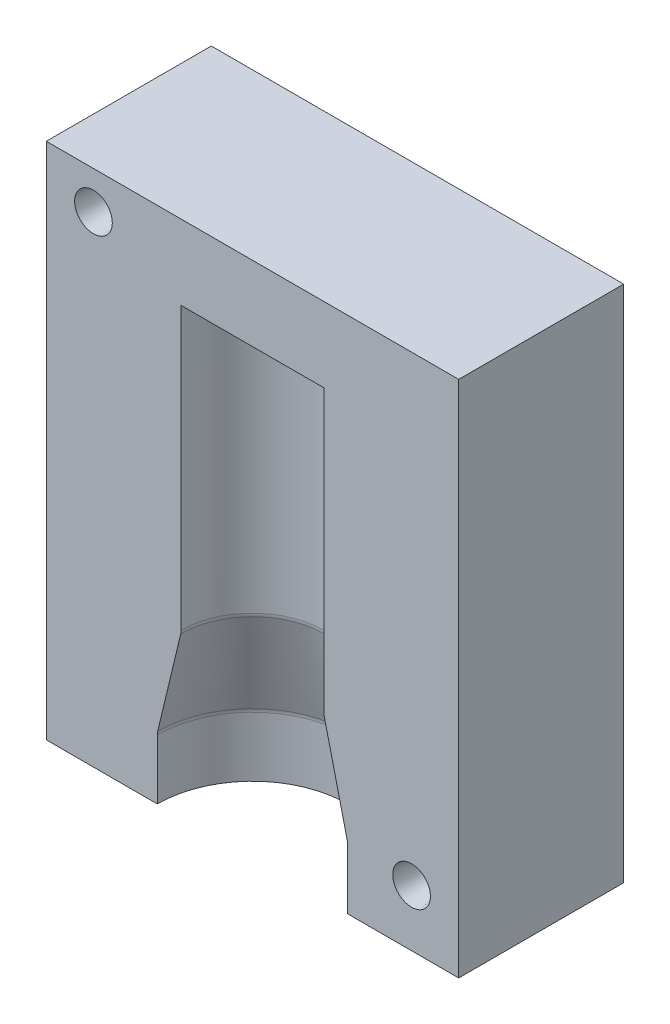
ISO-10303-21;
HEADER;
FILE_DESCRIPTION(('STEP AP214'),'2;1');
FILE_NAME('part.step','',(''),(''),'','','');
FILE_SCHEMA(('AUTOMOTIVE_DESIGN { 1 0 10303 214 1 1 1 1 }'));
ENDSEC;
DATA;
#1=APPLICATION_CONTEXT('core data for automotive mechanical design processes');
#2=APPLICATION_PROTOCOL_DEFINITION('international standard','automotive_design',2000,#1);
#3=PRODUCT_CONTEXT('',#1,'mechanical');
#4=PRODUCT('Part','Part','',(#3));
#5=PRODUCT_RELATED_PRODUCT_CATEGORY('part','',(#4));
#6=PRODUCT_DEFINITION_FORMATION('','',#4);
#7=PRODUCT_DEFINITION_CONTEXT('part definition',#1,'design');
#8=PRODUCT_DEFINITION('design','',#6,#7);
#9=PRODUCT_DEFINITION_SHAPE('','',#8);
#10=(LENGTH_UNIT() NAMED_UNIT(*) SI_UNIT(.MILLI.,.METRE.));
#11=(NAMED_UNIT(*) PLANE_ANGLE_UNIT() SI_UNIT($,.RADIAN.));
#12=(NAMED_UNIT(*) SI_UNIT($,.STERADIAN.) SOLID_ANGLE_UNIT());
#13=UNCERTAINTY_MEASURE_WITH_UNIT(LENGTH_MEASURE(1.E-05),#10,'distance_accuracy_value','');
#14=(GEOMETRIC_REPRESENTATION_CONTEXT(3) GLOBAL_UNCERTAINTY_ASSIGNED_CONTEXT((#13)) GLOBAL_UNIT_ASSIGNED_CONTEXT((#10,
#11,#12)) REPRESENTATION_CONTEXT('',''));
#15=CARTESIAN_POINT('',(0.,0.,0.));
#16=DIRECTION('',(0.,0.,1.));
#17=DIRECTION('',(1.,0.,0.));
#18=AXIS2_PLACEMENT_3D('',#15,#16,#17);
#19=CARTESIAN_POINT('',(87.5,27.2727272727273,-70.));
#20=DIRECTION('',(0.,1.,0.));
#21=DIRECTION('',(-1.,0.,0.));
#22=AXIS2_PLACEMENT_3D('',#19,#20,#21);
#23=PLANE('',#22);
#24=CARTESIAN_POINT('',(55.,27.2727272727273,-50.));
#25=DIRECTION('',(0.,1.,0.));
#26=DIRECTION('',(-1.,0.,0.));
#27=AXIS2_PLACEMENT_3D('',#24,#25,#26);
#28=CIRCLE('',#27,8.00000000000001);
#29=CARTESIAN_POINT('',(47.,27.2727272727273,-50.));
#30=VERTEX_POINT('',#29);
#31=EDGE_CURVE('E11',#30,#30,#28,.F.);
#32=ORIENTED_EDGE('',*,*,#31,.F.);
#33=EDGE_LOOP('',(#32));
#34=FACE_BOUND('',#33,.T.);
#35=CARTESIAN_POINT('',(-55.,27.2727272727273,-50.));
#36=DIRECTION('',(0.,1.,0.));
#37=DIRECTION('',(-1.,0.,0.));
#38=AXIS2_PLACEMENT_3D('',#35,#36,#37);
#39=CIRCLE('',#38,8.);
#40=CARTESIAN_POINT('',(-63.,27.2727272727273,-50.));
#41=VERTEX_POINT('',#40);
#42=EDGE_CURVE('E44',#41,#41,#39,.F.);
#43=ORIENTED_EDGE('',*,*,#42,.F.);
#44=EDGE_LOOP('',(#43));
#45=FACE_BOUND('',#44,.T.);
#46=DIRECTION('',(-1.,0.,0.));
#47=VECTOR('',#46,1.);
#48=CARTESIAN_POINT('',(87.5,27.2727272727273,0.));
#49=LINE('',#48,#47);
#50=CARTESIAN_POINT('',(87.5,27.2727272727273,0.));
#51=VERTEX_POINT('',#50);
#52=CARTESIAN_POINT('',(40.4040404040404,27.2727272727273,0.));
#53=VERTEX_POINT('',#52);
#54=EDGE_CURVE('E160',#51,#53,#49,.T.);
#55=ORIENTED_EDGE('',*,*,#54,.T.);
#56=CARTESIAN_POINT('',(0.,27.2727272727273,0.));
#57=DIRECTION('',(0.,1.,0.));
#58=DIRECTION('',(0.,0.,1.));
#59=AXIS2_PLACEMENT_3D('',#56,#57,#58);
#60=CIRCLE('',#59,40.4040404040404);
#61=CARTESIAN_POINT('',(-40.4040404040404,27.2727272727273,0.));
#62=VERTEX_POINT('',#61);
#63=EDGE_CURVE('E156',#53,#62,#60,.T.);
#64=ORIENTED_EDGE('',*,*,#63,.T.);
#65=CARTESIAN_POINT('',(-87.5,27.2727272727273,0.));
#66=VERTEX_POINT('',#65);
#67=EDGE_CURVE('E159',#62,#66,#49,.T.);
#68=ORIENTED_EDGE('',*,*,#67,.T.);
#69=DIRECTION('',(0.,0.,1.));
#70=VECTOR('',#69,1.);
#71=CARTESIAN_POINT('',(-87.5,27.2727272727273,-70.));
#72=LINE('',#71,#70);
#73=CARTESIAN_POINT('',(-87.5,27.2727272727273,-70.));
#74=VERTEX_POINT('',#73);
#75=EDGE_CURVE('E222',#74,#66,#72,.T.);
#76=ORIENTED_EDGE('',*,*,#75,.F.);
#77=DIRECTION('',(-1.,0.,0.));
#78=VECTOR('',#77,1.);
#79=CARTESIAN_POINT('',(87.5,27.2727272727273,-70.));
#80=LINE('',#79,#78);
#81=CARTESIAN_POINT('',(87.5,27.2727272727273,-70.));
#82=VERTEX_POINT('',#81);
#83=EDGE_CURVE('E145',#82,#74,#80,.T.);
#84=ORIENTED_EDGE('',*,*,#83,.F.);
#85=DIRECTION('',(0.,0.,1.));
#86=VECTOR('',#85,1.);
#87=CARTESIAN_POINT('',(87.5,27.2727272727273,-70.));
#88=LINE('',#87,#86);
#89=EDGE_CURVE('E180',#82,#51,#88,.T.);
#90=ORIENTED_EDGE('',*,*,#89,.T.);
#91=EDGE_LOOP('',(#55,#64,#68,#76,#84,#90));
#92=FACE_BOUND('',#91,.T.);
#93=ADVANCED_FACE('F37',(#34,#45,#92),#23,.F.);
#94=CARTESIAN_POINT('',(0.,0.,0.));
#95=DIRECTION('',(0.,0.,-1.));
#96=DIRECTION('',(-1.,0.,0.));
#97=AXIS2_PLACEMENT_3D('',#94,#95,#96);
#98=PLANE('',#97);
#99=CARTESIAN_POINT('',(34.3434343434344,52.6332114091182,0.));
#100=DIRECTION('',(0.,0.,1.));
#101=DIRECTION('',(1.,0.,0.));
#102=AXIS2_PLACEMENT_3D('',#99,#100,#101);
#103=CIRCLE('',#102,6.06060606060606);
#104=CARTESIAN_POINT('',(40.4040404040404,52.6332114091182,0.));
#105=VERTEX_POINT('',#104);
#106=CARTESIAN_POINT('',(40.2366907190739,54.0475929392717,0.));
#107=VERTEX_POINT('',#106);
#108=EDGE_CURVE('E154',#105,#107,#103,.T.);
#109=ORIENTED_EDGE('',*,*,#108,.F.);
#110=DIRECTION('',(0.,1.,0.));
#111=VECTOR('',#110,1.);
#112=CARTESIAN_POINT('',(40.4040404040404,155.555555555556,0.));
#113=LINE('',#112,#111);
#114=EDGE_CURVE('E171',#53,#105,#113,.T.);
#115=ORIENTED_EDGE('',*,*,#114,.F.);
#116=ORIENTED_EDGE('',*,*,#54,.F.);
#117=DIRECTION('',(0.,-1.,0.));
#118=VECTOR('',#117,1.);
#119=CARTESIAN_POINT('',(87.5,247.272727272727,0.));
#120=LINE('',#119,#118);
#121=CARTESIAN_POINT('',(87.5,247.272727272727,0.));
#122=VERTEX_POINT('',#121);
#123=EDGE_CURVE('E199',#122,#51,#120,.T.);
#124=ORIENTED_EDGE('',*,*,#123,.F.);
#125=DIRECTION('',(1.,0.,0.));
#126=VECTOR('',#125,1.);
#127=CARTESIAN_POINT('',(-87.5,247.272727272727,0.));
#128=LINE('',#127,#126);
#129=CARTESIAN_POINT('',(-87.5,247.272727272727,0.));
#130=VERTEX_POINT('',#129);
#131=EDGE_CURVE('E220',#130,#122,#128,.T.);
#132=ORIENTED_EDGE('',*,*,#131,.F.);
#133=DIRECTION('',(0.,1.,0.));
#134=VECTOR('',#133,1.);
#135=CARTESIAN_POINT('',(-87.5,27.2727272727273,0.));
#136=LINE('',#135,#134);
#137=EDGE_CURVE('E165',#66,#130,#136,.T.);
#138=ORIENTED_EDGE('',*,*,#137,.F.);
#139=ORIENTED_EDGE('',*,*,#67,.F.);
#140=DIRECTION('',(0.,1.,0.));
#141=VECTOR('',#140,1.);
#142=CARTESIAN_POINT('',(-40.4040404040404,155.555555555556,0.));
#143=LINE('',#142,#141);
#144=CARTESIAN_POINT('',(-40.4040404040404,52.6332114091182,0.));
#145=VERTEX_POINT('',#144);
#146=EDGE_CURVE('E140',#145,#62,#143,.F.);
#147=ORIENTED_EDGE('',*,*,#146,.F.);
#148=CARTESIAN_POINT('',(-34.3434343434344,52.6332114091182,0.));
#149=DIRECTION('',(0.,0.,1.));
#150=DIRECTION('',(1.,0.,0.));
#151=AXIS2_PLACEMENT_3D('',#148,#149,#150);
#152=CIRCLE('',#151,6.06060606060606);
#153=CARTESIAN_POINT('',(-40.2366907190739,54.0475929392717,0.));
#154=VERTEX_POINT('',#153);
#155=EDGE_CURVE('E172',#154,#145,#152,.T.);
#156=ORIENTED_EDGE('',*,*,#155,.F.);
#157=DIRECTION('',(-0.233372952475325,-0.972387301980517,0.));
#158=VECTOR('',#157,1.);
#159=CARTESIAN_POINT('',(0.,221.700470935412,0.));
#160=LINE('',#159,#158);
#161=CARTESIAN_POINT('',(-30.4703799879969,94.7405543187591,0.));
#162=VERTEX_POINT('',#161);
#163=EDGE_CURVE('E152',#162,#154,#160,.T.);
#164=ORIENTED_EDGE('',*,*,#163,.F.);
#165=CARTESIAN_POINT('',(-36.3636363636364,96.1549358489125,0.));
#166=DIRECTION('',(0.,0.,1.));
#167=DIRECTION('',(1.,0.,0.));
#168=AXIS2_PLACEMENT_3D('',#165,#166,#167);
#169=CIRCLE('',#168,6.06060606060606);
#170=CARTESIAN_POINT('',(-30.3030303030303,96.1549358489125,0.));
#171=VERTEX_POINT('',#170);
#172=EDGE_CURVE('E59',#162,#171,#169,.T.);
#173=ORIENTED_EDGE('',*,*,#172,.T.);
#174=DIRECTION('',(0.,1.,0.));
#175=VECTOR('',#174,1.);
#176=CARTESIAN_POINT('',(-30.3030303030303,155.555555555556,0.));
#177=LINE('',#176,#175);
#178=CARTESIAN_POINT('',(-30.3030303030303,215.555555555556,0.));
#179=VERTEX_POINT('',#178);
#180=EDGE_CURVE('E51',#179,#171,#177,.F.);
#181=ORIENTED_EDGE('',*,*,#180,.F.);
#182=DIRECTION('',(-1.,0.,0.));
#183=VECTOR('',#182,1.);
#184=CARTESIAN_POINT('',(60.,215.555555555556,0.));
#185=LINE('',#184,#183);
#186=CARTESIAN_POINT('',(30.3030303030303,215.555555555556,0.));
#187=VERTEX_POINT('',#186);
#188=EDGE_CURVE('E118',#187,#179,#185,.T.);
#189=ORIENTED_EDGE('',*,*,#188,.F.);
#190=DIRECTION('',(0.,1.,0.));
#191=VECTOR('',#190,1.);
#192=CARTESIAN_POINT('',(30.3030303030303,155.555555555556,0.));
#193=LINE('',#192,#191);
#194=CARTESIAN_POINT('',(30.3030303030303,96.1549358489125,0.));
#195=VERTEX_POINT('',#194);
#196=EDGE_CURVE('E119',#195,#187,#193,.T.);
#197=ORIENTED_EDGE('',*,*,#196,.F.);
#198=CARTESIAN_POINT('',(36.3636363636364,96.1549358489125,0.));
#199=DIRECTION('',(0.,0.,1.));
#200=DIRECTION('',(1.,0.,0.));
#201=AXIS2_PLACEMENT_3D('',#198,#199,#200);
#202=CIRCLE('',#201,6.06060606060606);
#203=CARTESIAN_POINT('',(30.4703799879969,94.7405543187591,0.));
#204=VERTEX_POINT('',#203);
#205=EDGE_CURVE('E169',#195,#204,#202,.T.);
#206=ORIENTED_EDGE('',*,*,#205,.T.);
#207=DIRECTION('',(-0.233372952475325,0.972387301980517,0.));
#208=VECTOR('',#207,1.);
#209=CARTESIAN_POINT('',(0.,221.700470935412,0.));
#210=LINE('',#209,#208);
#211=EDGE_CURVE('E126',#107,#204,#210,.T.);
#212=ORIENTED_EDGE('',*,*,#211,.F.);
#213=EDGE_LOOP('',(#109,#115,#116,#124,#132,#138,#139,#147,#156,#164,#173,#181,#189,#197,#206,#212));
#214=FACE_BOUND('',#213,.T.);
#215=CARTESIAN_POINT('',(67.5,51.2727272727273,0.));
#216=DIRECTION('',(0.,0.,1.));
#217=DIRECTION('',(1.,0.,0.));
#218=AXIS2_PLACEMENT_3D('',#215,#216,#217);
#219=CIRCLE('',#218,8.);
#220=CARTESIAN_POINT('',(75.5,51.2727272727273,0.));
#221=VERTEX_POINT('',#220);
#222=EDGE_CURVE('E166',#221,#221,#219,.F.);
#223=ORIENTED_EDGE('',*,*,#222,.T.);
#224=EDGE_LOOP('',(#223));
#225=FACE_BOUND('',#224,.T.);
#226=CARTESIAN_POINT('',(-67.5,231.272727272727,0.));
#227=DIRECTION('',(0.,0.,1.));
#228=DIRECTION('',(1.,0.,0.));
#229=AXIS2_PLACEMENT_3D('',#226,#227,#228);
#230=CIRCLE('',#229,8.);
#231=CARTESIAN_POINT('',(-59.5,231.272727272727,0.));
#232=VERTEX_POINT('',#231);
#233=EDGE_CURVE('E162',#232,#232,#230,.F.);
#234=ORIENTED_EDGE('',*,*,#233,.T.);
#235=EDGE_LOOP('',(#234));
#236=FACE_BOUND('',#235,.T.);
#237=ADVANCED_FACE('F129',(#214,#225,#236),#98,.F.);
#238=CARTESIAN_POINT('',(-87.5,27.2727272727273,-70.));
#239=DIRECTION('',(1.,0.,0.));
#240=DIRECTION('',(0.,1.,0.));
#241=AXIS2_PLACEMENT_3D('',#238,#239,#240);
#242=PLANE('',#241);
#243=ORIENTED_EDGE('',*,*,#137,.T.);
#244=DIRECTION('',(0.,0.,1.));
#245=VECTOR('',#244,1.);
#246=CARTESIAN_POINT('',(-87.5,247.272727272727,-70.));
#247=LINE('',#246,#245);
#248=CARTESIAN_POINT('',(-87.5,247.272727272727,-70.));
#249=VERTEX_POINT('',#248);
#250=EDGE_CURVE('E219',#249,#130,#247,.T.);
#251=ORIENTED_EDGE('',*,*,#250,.F.);
#252=DIRECTION('',(0.,1.,0.));
#253=VECTOR('',#252,1.);
#254=CARTESIAN_POINT('',(-87.5,27.2727272727273,-70.));
#255=LINE('',#254,#253);
#256=EDGE_CURVE('E224',#74,#249,#255,.T.);
#257=ORIENTED_EDGE('',*,*,#256,.F.);
#258=ORIENTED_EDGE('',*,*,#75,.T.);
#259=EDGE_LOOP('',(#243,#251,#257,#258));
#260=FACE_BOUND('',#259,.T.);
#261=ADVANCED_FACE('F279',(#260),#242,.F.);
#262=CARTESIAN_POINT('',(-87.5,247.272727272727,-70.));
#263=DIRECTION('',(0.,-1.,0.));
#264=DIRECTION('',(1.,0.,0.));
#265=AXIS2_PLACEMENT_3D('',#262,#263,#264);
#266=PLANE('',#265);
#267=ORIENTED_EDGE('',*,*,#131,.T.);
#268=DIRECTION('',(0.,0.,1.));
#269=VECTOR('',#268,1.);
#270=CARTESIAN_POINT('',(87.5,247.272727272727,-70.));
#271=LINE('',#270,#269);
#272=CARTESIAN_POINT('',(87.5,247.272727272727,-70.));
#273=VERTEX_POINT('',#272);
#274=EDGE_CURVE('E216',#273,#122,#271,.T.);
#275=ORIENTED_EDGE('',*,*,#274,.F.);
#276=DIRECTION('',(1.,0.,0.));
#277=VECTOR('',#276,1.);
#278=CARTESIAN_POINT('',(-87.5,247.272727272727,-70.));
#279=LINE('',#278,#277);
#280=EDGE_CURVE('E142',#249,#273,#279,.T.);
#281=ORIENTED_EDGE('',*,*,#280,.F.);
#282=ORIENTED_EDGE('',*,*,#250,.T.);
#283=EDGE_LOOP('',(#267,#275,#281,#282));
#284=FACE_BOUND('',#283,.T.);
#285=ADVANCED_FACE('F235',(#284),#266,.F.);
#286=CARTESIAN_POINT('',(87.5,247.272727272727,-70.));
#287=DIRECTION('',(-1.,0.,0.));
#288=DIRECTION('',(0.,0.,1.));
#289=AXIS2_PLACEMENT_3D('',#286,#287,#288);
#290=PLANE('',#289);
#291=ORIENTED_EDGE('',*,*,#123,.T.);
#292=ORIENTED_EDGE('',*,*,#89,.F.);
#293=DIRECTION('',(0.,-1.,0.));
#294=VECTOR('',#293,1.);
#295=CARTESIAN_POINT('',(87.5,247.272727272727,-70.));
#296=LINE('',#295,#294);
#297=EDGE_CURVE('E133',#273,#82,#296,.T.);
#298=ORIENTED_EDGE('',*,*,#297,.F.);
#299=ORIENTED_EDGE('',*,*,#274,.T.);
#300=EDGE_LOOP('',(#291,#292,#298,#299));
#301=FACE_BOUND('',#300,.T.);
#302=ADVANCED_FACE('F232',(#301),#290,.F.);
#303=CARTESIAN_POINT('',(0.,0.,-70.));
#304=DIRECTION('',(0.,0.,-1.));
#305=DIRECTION('',(-1.,0.,0.));
#306=AXIS2_PLACEMENT_3D('',#303,#304,#305);
#307=PLANE('',#306);
#308=ORIENTED_EDGE('',*,*,#83,.T.);
#309=ORIENTED_EDGE('',*,*,#256,.T.);
#310=ORIENTED_EDGE('',*,*,#280,.T.);
#311=ORIENTED_EDGE('',*,*,#297,.T.);
#312=EDGE_LOOP('',(#308,#309,#310,#311));
#313=FACE_BOUND('',#312,.T.);
#314=ADVANCED_FACE('F286',(#313),#307,.T.);
#315=CARTESIAN_POINT('',(-67.5,231.272727272727,0.));
#316=DIRECTION('',(0.,0.,1.));
#317=DIRECTION('',(-1.,0.,0.));
#318=AXIS2_PLACEMENT_3D('',#315,#316,#317);
#319=CONICAL_SURFACE('',#318,8.,0.10471975511966);
#320=ORIENTED_EDGE('',*,*,#233,.F.);
#321=EDGE_LOOP('',(#320));
#322=FACE_BOUND('',#321,.T.);
#323=CARTESIAN_POINT('',(-67.5,231.272727272727,-18.));
#324=DIRECTION('',(0.,0.,1.));
#325=DIRECTION('',(1.,0.,0.));
#326=AXIS2_PLACEMENT_3D('',#323,#324,#325);
#327=CIRCLE('',#326,6.10812376521783);
#328=CARTESIAN_POINT('',(-61.3918762347822,231.272727272727,-18.));
#329=VERTEX_POINT('',#328);
#330=EDGE_CURVE('E240',#329,#329,#327,.T.);
#331=ORIENTED_EDGE('',*,*,#330,.F.);
#332=EDGE_LOOP('',(#331));
#333=FACE_BOUND('',#332,.T.);
#334=ADVANCED_FACE('F289',(#322,#333),#319,.F.);
#335=CARTESIAN_POINT('',(67.5,51.2727272727273,0.));
#336=DIRECTION('',(0.,0.,1.));
#337=DIRECTION('',(-1.,0.,0.));
#338=AXIS2_PLACEMENT_3D('',#335,#336,#337);
#339=CONICAL_SURFACE('',#338,8.,0.10471975511966);
#340=ORIENTED_EDGE('',*,*,#222,.F.);
#341=EDGE_LOOP('',(#340));
#342=FACE_BOUND('',#341,.T.);
#343=CARTESIAN_POINT('',(67.5,51.2727272727273,-18.));
#344=DIRECTION('',(0.,0.,1.));
#345=DIRECTION('',(1.,0.,0.));
#346=AXIS2_PLACEMENT_3D('',#343,#344,#345);
#347=CIRCLE('',#346,6.10812376521781);
#348=CARTESIAN_POINT('',(73.6081237652178,51.2727272727273,-18.));
#349=VERTEX_POINT('',#348);
#350=EDGE_CURVE('E182',#349,#349,#347,.T.);
#351=ORIENTED_EDGE('',*,*,#350,.F.);
#352=EDGE_LOOP('',(#351));
#353=FACE_BOUND('',#352,.T.);
#354=ADVANCED_FACE('F292',(#342,#353),#339,.F.);
#355=CARTESIAN_POINT('',(0.,215.555555555556,0.));
#356=DIRECTION('',(0.,0.978147600733806,-0.20791169081776));
#357=DIRECTION('',(0.,0.20791169081776,0.978147600733806));
#358=AXIS2_PLACEMENT_3D('',#355,#356,#357);
#359=PLANE('',#358);
#360=ORIENTED_EDGE('',*,*,#188,.T.);
#361=CARTESIAN_POINT('',(0.,215.555555555556,0.));
#362=DIRECTION('',(0.,0.978147600733806,-0.20791169081776));
#363=DIRECTION('',(0.,0.20791169081776,0.978147600733806));
#364=AXIS2_PLACEMENT_3D('',#361,#362,#363);
#365=ELLIPSE('',#364,30.980018026213,30.3030303030303);
#366=EDGE_CURVE('E114',#187,#179,#365,.T.);
#367=ORIENTED_EDGE('',*,*,#366,.F.);
#368=EDGE_LOOP('',(#360,#367));
#369=FACE_BOUND('',#368,.T.);
#370=ADVANCED_FACE('F116',(#369),#359,.F.);
#371=CARTESIAN_POINT('',(0.,155.555555555556,0.));
#372=DIRECTION('',(0.,1.,0.));
#373=DIRECTION('',(0.,0.,1.));
#374=AXIS2_PLACEMENT_3D('',#371,#372,#373);
#375=CYLINDRICAL_SURFACE('',#374,40.4040404040404);
#376=CARTESIAN_POINT('',(0.,52.6332114091182,0.));
#377=DIRECTION('',(0.,1.,0.));
#378=DIRECTION('',(0.,0.,1.));
#379=AXIS2_PLACEMENT_3D('',#376,#377,#378);
#380=CIRCLE('',#379,40.4040404040404);
#381=EDGE_CURVE('E132',#105,#145,#380,.T.);
#382=ORIENTED_EDGE('',*,*,#381,.T.);
#383=ORIENTED_EDGE('',*,*,#146,.T.);
#384=ORIENTED_EDGE('',*,*,#63,.F.);
#385=ORIENTED_EDGE('',*,*,#114,.T.);
#386=EDGE_LOOP('',(#382,#383,#384,#385));
#387=FACE_BOUND('',#386,.T.);
#388=ADVANCED_FACE('F203',(#387),#375,.F.);
#389=CARTESIAN_POINT('',(0.,52.6332114091182,0.));
#390=DIRECTION('',(0.,1.,0.));
#391=DIRECTION('',(0.,0.,1.));
#392=AXIS2_PLACEMENT_3D('',#389,#390,#391);
#393=TOROIDAL_SURFACE('',#392,34.3434343434344,6.06060606060606);
#394=CARTESIAN_POINT('',(0.,54.0475929392717,0.));
#395=DIRECTION('',(0.,-1.,0.));
#396=DIRECTION('',(0.,0.,-1.));
#397=AXIS2_PLACEMENT_3D('',#394,#395,#396);
#398=CIRCLE('',#397,40.2366907190739);
#399=EDGE_CURVE('E149',#154,#107,#398,.T.);
#400=ORIENTED_EDGE('',*,*,#399,.F.);
#401=ORIENTED_EDGE('',*,*,#155,.T.);
#402=ORIENTED_EDGE('',*,*,#381,.F.);
#403=ORIENTED_EDGE('',*,*,#108,.T.);
#404=EDGE_LOOP('',(#400,#401,#402,#403));
#405=FACE_BOUND('',#404,.T.);
#406=ADVANCED_FACE('F207',(#405),#393,.F.);
#407=CARTESIAN_POINT('',(0.,95.4378446727864,0.));
#408=DIRECTION('',(0.,-1.,0.));
#409=DIRECTION('',(0.,0.,-1.));
#410=AXIS2_PLACEMENT_3D('',#407,#408,#409);
#411=CONICAL_SURFACE('',#410,30.3030303030303,0.235544980720864);
#412=CARTESIAN_POINT('',(0.,94.7405543187591,0.));
#413=DIRECTION('',(0.,1.,0.));
#414=DIRECTION('',(0.,0.,1.));
#415=AXIS2_PLACEMENT_3D('',#412,#413,#414);
#416=CIRCLE('',#415,30.4703799879969);
#417=EDGE_CURVE('E153',#204,#162,#416,.T.);
#418=ORIENTED_EDGE('',*,*,#417,.T.);
#419=ORIENTED_EDGE('',*,*,#163,.T.);
#420=ORIENTED_EDGE('',*,*,#399,.T.);
#421=ORIENTED_EDGE('',*,*,#211,.T.);
#422=EDGE_LOOP('',(#418,#419,#420,#421));
#423=FACE_BOUND('',#422,.T.);
#424=ADVANCED_FACE('F295',(#423),#411,.F.);
#425=CARTESIAN_POINT('',(0.,96.1549358489125,0.));
#426=DIRECTION('',(0.,-1.,0.));
#427=DIRECTION('',(0.,0.,-1.));
#428=AXIS2_PLACEMENT_3D('',#425,#426,#427);
#429=TOROIDAL_SURFACE('',#428,36.3636363636364,6.06060606060606);
#430=ORIENTED_EDGE('',*,*,#205,.F.);
#431=CARTESIAN_POINT('',(0.,96.1549358489125,0.));
#432=DIRECTION('',(0.,-1.,0.));
#433=DIRECTION('',(0.,0.,-1.));
#434=AXIS2_PLACEMENT_3D('',#431,#432,#433);
#435=CIRCLE('',#434,30.3030303030303);
#436=EDGE_CURVE('E123',#171,#195,#435,.T.);
#437=ORIENTED_EDGE('',*,*,#436,.F.);
#438=ORIENTED_EDGE('',*,*,#172,.F.);
#439=ORIENTED_EDGE('',*,*,#417,.F.);
#440=EDGE_LOOP('',(#430,#437,#438,#439));
#441=FACE_BOUND('',#440,.T.);
#442=ADVANCED_FACE('F298',(#441),#429,.T.);
#443=CARTESIAN_POINT('',(0.,155.555555555556,0.));
#444=DIRECTION('',(0.,1.,0.));
#445=DIRECTION('',(0.,0.,1.));
#446=AXIS2_PLACEMENT_3D('',#443,#444,#445);
#447=CYLINDRICAL_SURFACE('',#446,30.3030303030303);
#448=ORIENTED_EDGE('',*,*,#196,.T.);
#449=ORIENTED_EDGE('',*,*,#366,.T.);
#450=ORIENTED_EDGE('',*,*,#180,.T.);
#451=ORIENTED_EDGE('',*,*,#436,.T.);
#452=EDGE_LOOP('',(#448,#449,#450,#451));
#453=FACE_BOUND('',#452,.T.);
#454=ADVANCED_FACE('F122',(#453),#447,.F.);
#455=CARTESIAN_POINT('',(67.5,51.2727272727273,-18.));
#456=DIRECTION('',(0.,0.,1.));
#457=DIRECTION('',(1.,0.,0.));
#458=AXIS2_PLACEMENT_3D('',#455,#456,#457);
#459=PLANE('',#458);
#460=ORIENTED_EDGE('',*,*,#350,.T.);
#461=EDGE_LOOP('',(#460));
#462=FACE_BOUND('',#461,.T.);
#463=ADVANCED_FACE('F272',(#462),#459,.T.);
#464=CARTESIAN_POINT('',(-67.5,231.272727272727,-18.));
#465=DIRECTION('',(0.,0.,1.));
#466=DIRECTION('',(1.,0.,0.));
#467=AXIS2_PLACEMENT_3D('',#464,#465,#466);
#468=PLANE('',#467);
#469=ORIENTED_EDGE('',*,*,#330,.T.);
#470=EDGE_LOOP('',(#469));
#471=FACE_BOUND('',#470,.T.);
#472=ADVANCED_FACE('F270',(#471),#468,.T.);
#473=CARTESIAN_POINT('',(-55.,27.2727272727273,-50.));
#474=DIRECTION('',(0.,1.,0.));
#475=DIRECTION('',(1.,0.,0.));
#476=AXIS2_PLACEMENT_3D('',#473,#474,#475);
#477=CONICAL_SURFACE('',#476,8.,0.10471975511966);
#478=CARTESIAN_POINT('',(-55.,11.2727272727273,-50.));
#479=DIRECTION('',(0.,-1.,0.));
#480=DIRECTION('',(1.,0.,0.));
#481=AXIS2_PLACEMENT_3D('',#478,#479,#480);
#482=CIRCLE('',#481,6.31833223574917);
#483=CARTESIAN_POINT('',(-48.6816677642508,11.2727272727273,-50.));
#484=VERTEX_POINT('',#483);
#485=EDGE_CURVE('E243',#484,#484,#482,.T.);
#486=ORIENTED_EDGE('',*,*,#485,.F.);
#487=EDGE_LOOP('',(#486));
#488=FACE_BOUND('',#487,.T.);
#489=ORIENTED_EDGE('',*,*,#42,.T.);
#490=EDGE_LOOP('',(#489));
#491=FACE_BOUND('',#490,.T.);
#492=ADVANCED_FACE('F186',(#488,#491),#477,.T.);
#493=CARTESIAN_POINT('',(-55.,11.2727272727273,-50.));
#494=DIRECTION('',(0.,-1.,0.));
#495=DIRECTION('',(1.,0.,0.));
#496=AXIS2_PLACEMENT_3D('',#493,#494,#495);
#497=PLANE('',#496);
#498=ORIENTED_EDGE('',*,*,#485,.T.);
#499=EDGE_LOOP('',(#498));
#500=FACE_BOUND('',#499,.T.);
#501=ADVANCED_FACE('F257',(#500),#497,.T.);
#502=CARTESIAN_POINT('',(55.,27.2727272727273,-50.));
#503=DIRECTION('',(0.,1.,0.));
#504=DIRECTION('',(1.,0.,0.));
#505=AXIS2_PLACEMENT_3D('',#502,#503,#504);
#506=CONICAL_SURFACE('',#505,8.00000000000001,0.10471975511966);
#507=CARTESIAN_POINT('',(55.,11.2727272727273,-50.));
#508=DIRECTION('',(0.,-1.,0.));
#509=DIRECTION('',(1.,0.,0.));
#510=AXIS2_PLACEMENT_3D('',#507,#508,#509);
#511=CIRCLE('',#510,6.31833223574918);
#512=CARTESIAN_POINT('',(61.3183322357492,11.2727272727273,-50.));
#513=VERTEX_POINT('',#512);
#514=EDGE_CURVE('E248',#513,#513,#511,.T.);
#515=ORIENTED_EDGE('',*,*,#514,.F.);
#516=EDGE_LOOP('',(#515));
#517=FACE_BOUND('',#516,.T.);
#518=ORIENTED_EDGE('',*,*,#31,.T.);
#519=EDGE_LOOP('',(#518));
#520=FACE_BOUND('',#519,.T.);
#521=ADVANCED_FACE('F254',(#517,#520),#506,.T.);
#522=CARTESIAN_POINT('',(55.,11.2727272727273,-50.));
#523=DIRECTION('',(0.,-1.,0.));
#524=DIRECTION('',(1.,0.,0.));
#525=AXIS2_PLACEMENT_3D('',#522,#523,#524);
#526=PLANE('',#525);
#527=ORIENTED_EDGE('',*,*,#514,.T.);
#528=EDGE_LOOP('',(#527));
#529=FACE_BOUND('',#528,.T.);
#530=ADVANCED_FACE('F252',(#529),#526,.T.);
#531=CLOSED_SHELL('',(#93,#237,#261,#285,#302,#314,#334,#354,#370,#388,#406,#424,#442,#454,#463,
#472,#492,#501,#521,#530));
#532=MANIFOLD_SOLID_BREP('B2',#531);
#533=ADVANCED_BREP_SHAPE_REPRESENTATION('',(#18,#532),#14);
#534=SHAPE_DEFINITION_REPRESENTATION(#9,#533);
ENDSEC;
END-ISO-10303-21;
